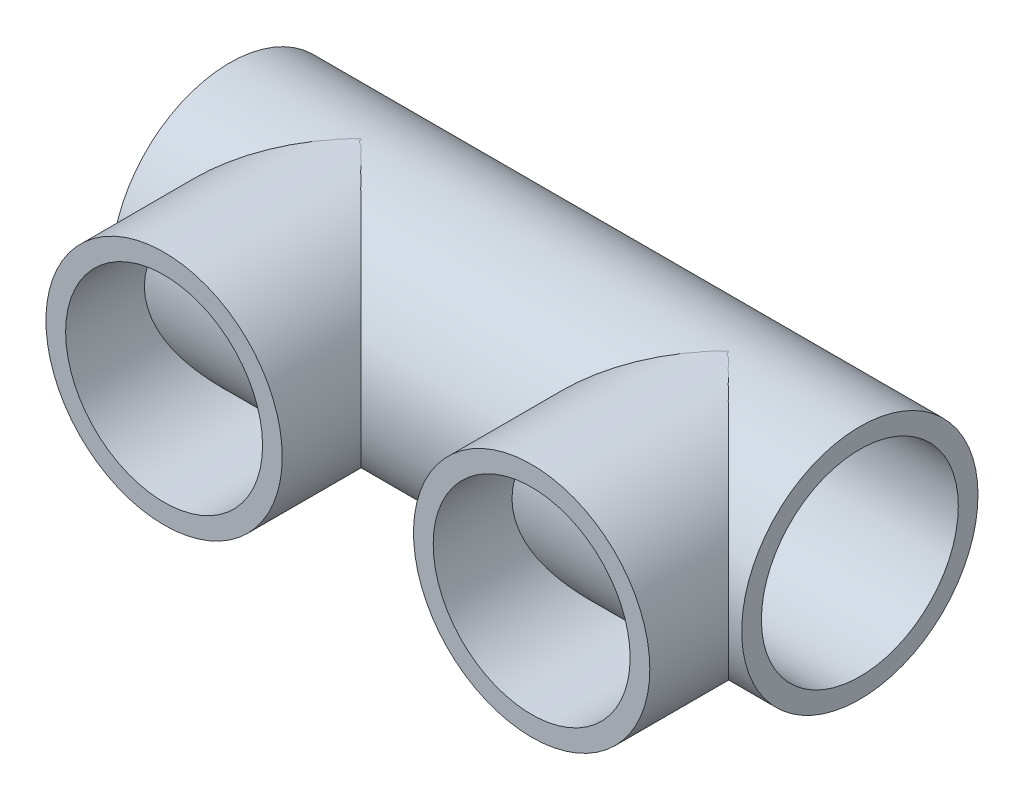
ISO-10303-21;
HEADER;
FILE_DESCRIPTION(('STEP AP214'),'2;1');
FILE_NAME('part.step','',(''),(''),'','','');
FILE_SCHEMA(('AUTOMOTIVE_DESIGN { 1 0 10303 214 1 1 1 1 }'));
ENDSEC;
DATA;
#1=APPLICATION_CONTEXT('core data for automotive mechanical design processes');
#2=APPLICATION_PROTOCOL_DEFINITION('international standard','automotive_design',2000,#1);
#3=PRODUCT_CONTEXT('',#1,'mechanical');
#4=PRODUCT('Part','Part','',(#3));
#5=PRODUCT_RELATED_PRODUCT_CATEGORY('part','',(#4));
#6=PRODUCT_DEFINITION_FORMATION('','',#4);
#7=PRODUCT_DEFINITION_CONTEXT('part definition',#1,'design');
#8=PRODUCT_DEFINITION('design','',#6,#7);
#9=PRODUCT_DEFINITION_SHAPE('','',#8);
#10=(LENGTH_UNIT() NAMED_UNIT(*) SI_UNIT(.MILLI.,.METRE.));
#11=(NAMED_UNIT(*) PLANE_ANGLE_UNIT() SI_UNIT($,.RADIAN.));
#12=(NAMED_UNIT(*) SI_UNIT($,.STERADIAN.) SOLID_ANGLE_UNIT());
#13=UNCERTAINTY_MEASURE_WITH_UNIT(LENGTH_MEASURE(1.E-05),#10,'distance_accuracy_value','');
#14=(GEOMETRIC_REPRESENTATION_CONTEXT(3) GLOBAL_UNCERTAINTY_ASSIGNED_CONTEXT((#13)) GLOBAL_UNIT_ASSIGNED_CONTEXT((#10,
#11,#12)) REPRESENTATION_CONTEXT('',''));
#15=CARTESIAN_POINT('',(0.,0.,0.));
#16=DIRECTION('',(0.,0.,1.));
#17=DIRECTION('',(1.,0.,0.));
#18=AXIS2_PLACEMENT_3D('',#15,#16,#17);
#19=CARTESIAN_POINT('',(38.,0.,15.));
#20=DIRECTION('',(0.,0.,-1.));
#21=DIRECTION('',(-1.,0.,0.));
#22=AXIS2_PLACEMENT_3D('',#19,#20,#21);
#23=CYLINDRICAL_SURFACE('',#22,7.5);
#24=CARTESIAN_POINT('',(38.,0.,15.));
#25=DIRECTION('',(0.,0.,1.));
#26=DIRECTION('',(1.,0.,0.));
#27=AXIS2_PLACEMENT_3D('',#24,#25,#26);
#28=CIRCLE('',#27,7.5);
#29=CARTESIAN_POINT('',(45.5,0.,15.));
#30=VERTEX_POINT('',#29);
#31=EDGE_CURVE('E94',#30,#30,#28,.T.);
#32=ORIENTED_EDGE('',*,*,#31,.T.);
#33=EDGE_LOOP('',(#32));
#34=FACE_BOUND('',#33,.T.);
#35=CARTESIAN_POINT('',(30.5,0.,9.));
#36=CARTESIAN_POINT('',(30.5000010057864,0.178153969147354,8.99999902078454));
#37=CARTESIAN_POINT('',(30.5063589008688,0.35632298261134,8.99469882283173));
#38=CARTESIAN_POINT('',(30.5316723160512,0.711146050434394,8.97362079437447));
#39=CARTESIAN_POINT('',(30.55062928056,0.887799928739864,8.95784176253385));
#40=CARTESIAN_POINT('',(30.60080410535,1.2382455909623,8.91615976232059));
#41=CARTESIAN_POINT('',(30.6320292203917,1.41203561786725,8.89025080366843));
#42=CARTESIAN_POINT('',(30.7061969223034,1.7553587935121,8.82888045728097));
#43=CARTESIAN_POINT('',(30.7491394354058,1.92489196904391,8.7934191296832));
#44=CARTESIAN_POINT('',(30.845757960041,2.25757382136561,8.71392164535409));
#45=CARTESIAN_POINT('',(30.8993647687716,2.42075594549693,8.66994081938386));
#46=CARTESIAN_POINT('',(31.0167634667215,2.74108056207663,8.5740565095168));
#47=CARTESIAN_POINT('',(31.0805597989083,2.89822038262574,8.52214957000969));
#48=CARTESIAN_POINT('',(31.2175507718221,3.20573129384688,8.41130175961026));
#49=CARTESIAN_POINT('',(31.2907441109994,3.35610331801683,8.35236186291027));
#50=CARTESIAN_POINT('',(31.4458071898899,3.64967491217059,8.22832182005492));
#51=CARTESIAN_POINT('',(31.5276787720561,3.79287294952446,8.16322036607252));
#52=CARTESIAN_POINT('',(31.7309689457276,4.12303253202533,8.00284518096207));
#53=CARTESIAN_POINT('',(31.8558670347129,4.30674703745717,7.90527271928849));
#54=CARTESIAN_POINT('',(32.1190978886581,4.65977577954254,7.70246473974503));
#55=CARTESIAN_POINT('',(32.2574352007178,4.8290851056693,7.59722663127292));
#56=CARTESIAN_POINT('',(32.5466979666458,5.15352808798878,7.3810053748656));
#57=CARTESIAN_POINT('',(32.6976542347339,5.30862498346819,7.27000843062842));
#58=CARTESIAN_POINT('',(33.010990015136,5.60411971357477,7.04473932058204));
#59=CARTESIAN_POINT('',(33.1733680876061,5.74451939541484,6.93046756867072));
#60=CARTESIAN_POINT('',(33.5121973741132,6.01308771712544,6.69886421944047));
#61=CARTESIAN_POINT('',(33.6888525475146,6.14098379728719,6.58151500715291));
#62=CARTESIAN_POINT('',(34.0535309946945,6.38146685964443,6.34861374542259));
#63=CARTESIAN_POINT('',(34.2415580448988,6.49404871544582,6.23306230918773));
#64=CARTESIAN_POINT('',(34.6288007157147,6.70323191819961,6.00751709342867));
#65=CARTESIAN_POINT('',(34.8279884489955,6.79987090825118,5.89751066108234));
#66=CARTESIAN_POINT('',(35.2383297636461,6.97660978913542,5.68733200599137));
#67=CARTESIAN_POINT('',(35.4494729521105,7.05672377219729,5.58715144248699));
#68=CARTESIAN_POINT('',(35.9050423822036,7.20581139804351,5.39375054153033));
#69=CARTESIAN_POINT('',(36.1507335570095,7.27303815984157,5.30206159225364));
#70=CARTESIAN_POINT('',(36.5296101494213,7.35558556376292,5.1862924366239));
#71=CARTESIAN_POINT('',(36.6575371684877,7.38004237965331,5.15134611493354));
#72=CARTESIAN_POINT('',(36.9164552559326,7.42247386801848,5.0900167217734));
#73=CARTESIAN_POINT('',(37.0474446705555,7.44045195679875,5.0636291379211));
#74=CARTESIAN_POINT('',(37.3134847629683,7.4697274665406,5.0203457675602));
#75=CARTESIAN_POINT('',(37.448565957836,7.48093648768762,5.00357571644289));
#76=CARTESIAN_POINT('',(37.7200521910013,7.49600593121143,4.98097213613006));
#77=CARTESIAN_POINT('',(37.8564571043124,7.49986704072694,4.97513758430392));
#78=CARTESIAN_POINT('',(38.1292913300053,7.50012618903397,4.97474699327439));
#79=CARTESIAN_POINT('',(38.265720642439,7.49652421174242,4.98019097837639));
#80=CARTESIAN_POINT('',(38.5373004697741,7.48196560183749,5.00203537341002));
#81=CARTESIAN_POINT('',(38.6724508268724,7.4710080733606,5.01843711793209));
#82=CARTESIAN_POINT('',(38.9514339457437,7.44083697124258,5.06307474091476));
#83=CARTESIAN_POINT('',(39.0950608694159,7.42101578104718,5.09217681926413));
#84=CARTESIAN_POINT('',(39.378613681429,7.37360940002843,5.16058211520389));
#85=CARTESIAN_POINT('',(39.5185368742111,7.34601871582733,5.19989254901968));
#86=CARTESIAN_POINT('',(39.7944307993402,7.28354878875738,5.28704001546879));
#87=CARTESIAN_POINT('',(39.9303898208141,7.24865003881939,5.33489981723021));
#88=CARTESIAN_POINT('',(40.1977246528952,7.17212216286467,5.43734828215007));
#89=CARTESIAN_POINT('',(40.3291013884723,7.13049440482164,5.49193557710803));
#90=CARTESIAN_POINT('',(40.6634059310218,7.01451779745416,5.64001965117919));
#91=CARTESIAN_POINT('',(40.8629031623279,6.93533714297783,5.73749761155111));
#92=CARTESIAN_POINT('',(41.250986005591,6.76212098875534,5.94067179855828));
#93=CARTESIAN_POINT('',(41.4395651296926,6.6680767779642,6.04637282590248));
#94=CARTESIAN_POINT('',(41.8064859629529,6.46564864959083,6.26237432607995));
#95=CARTESIAN_POINT('',(41.9848134666537,6.35724549072149,6.372680832086));
#96=CARTESIAN_POINT('',(42.3311557538796,6.12653021732014,6.59479170795521));
#97=CARTESIAN_POINT('',(42.499172598227,6.00422089628763,6.70659577301854));
#98=CARTESIAN_POINT('',(42.833390753746,5.73900605569622,6.93513068751245));
#99=CARTESIAN_POINT('',(42.9990369092601,5.59535765371466,7.05181317180441));
#100=CARTESIAN_POINT('',(43.3184002203485,5.29273175973209,7.28169682859756));
#101=CARTESIAN_POINT('',(43.472115599873,5.13375199332901,7.39489748127484));
#102=CARTESIAN_POINT('',(43.7664034337602,4.80081846303794,7.61524275681291));
#103=CARTESIAN_POINT('',(43.9070000688744,4.62689343117928,7.72239837178886));
#104=CARTESIAN_POINT('',(44.1740521920132,4.26401070130268,7.92853846042055));
#105=CARTESIAN_POINT('',(44.3005124564013,4.0750581179137,8.02752569101303));
#106=CARTESIAN_POINT('',(44.5086693739933,3.73058078632899,8.19205561121926));
#107=CARTESIAN_POINT('',(44.5937524796657,3.57817312113296,8.25985939036692));
#108=CARTESIAN_POINT('',(44.7540940717062,3.26543648544591,8.38841402039979));
#109=CARTESIAN_POINT('',(44.8293548763508,3.10510939647011,8.44916653516056));
#110=CARTESIAN_POINT('',(44.9691660359821,2.77713682738387,8.5625699831515));
#111=CARTESIAN_POINT('',(45.0337199839725,2.6094938262962,8.61522363376343));
#112=CARTESIAN_POINT('',(45.1512556136575,2.26764337646391,8.71144750368668));
#113=CARTESIAN_POINT('',(45.2042371077518,2.09343582135535,8.75501757574411));
#114=CARTESIAN_POINT('',(45.2981383828374,1.73815745690473,8.83244656264963));
#115=CARTESIAN_POINT('',(45.3389613536125,1.5570438723224,8.86622747837933));
#116=CARTESIAN_POINT('',(45.407237578285,1.19061277670687,8.92282485554544));
#117=CARTESIAN_POINT('',(45.4346908023521,1.00529525629487,8.94564129251806));
#118=CARTESIAN_POINT('',(45.475665348686,0.632166039498279,8.97972399159536));
#119=CARTESIAN_POINT('',(45.4891940195714,0.444355711746269,8.99099634602051));
#120=CARTESIAN_POINT('',(45.502055814718,0.0679219552883391,9.00171249935012));
#121=CARTESIAN_POINT('',(45.5013904835677,-0.120701382712558,9.00115758529573));
#122=CARTESIAN_POINT('',(45.4868199274725,-0.474324637421768,8.98901891067002));
#123=CARTESIAN_POINT('',(45.4745149081936,-0.639440216493619,8.97876813322393));
#124=CARTESIAN_POINT('',(45.4391329303291,-0.967764857264276,8.94933527598237));
#125=CARTESIAN_POINT('',(45.4160523964841,-1.13097326773745,8.93015023184924));
#126=CARTESIAN_POINT('',(45.3594868704201,-1.45426161073626,8.88323127277689));
#127=CARTESIAN_POINT('',(45.3260052823641,-1.61434254865923,8.85550015490737));
#128=CARTESIAN_POINT('',(45.2491080588724,-1.9305229069349,8.79199057069989));
#129=CARTESIAN_POINT('',(45.205688639473,-2.0866207854552,8.75620903914643));
#130=CARTESIAN_POINT('',(45.108867300918,-2.39595575206166,8.67670556523535));
#131=CARTESIAN_POINT('',(45.055343737124,-2.54912988520823,8.63288707011419));
#132=CARTESIAN_POINT('',(44.9393284207758,-2.84986550446535,8.53833445929783));
#133=CARTESIAN_POINT('',(44.8768332101543,-2.99742479849771,8.48759767737068));
#134=CARTESIAN_POINT('',(44.6768545198958,-3.43085007661301,8.32611263438776));
#135=CARTESIAN_POINT('',(44.5268249353359,-3.7076298707447,8.20604568840655));
#136=CARTESIAN_POINT('',(44.2436294139193,-4.16146504282976,7.9829540827251));
#137=CARTESIAN_POINT('',(44.1171593735551,-4.34502322432915,7.88431346355617));
#138=CARTESIAN_POINT('',(43.8507061511021,-4.69766413926584,7.67942018895149));
#139=CARTESIAN_POINT('',(43.7107177718954,-4.86674125795192,7.57316461002928));
#140=CARTESIAN_POINT('',(43.4180688180848,-5.19059982119121,7.35499304047176));
#141=CARTESIAN_POINT('',(43.2653734563386,-5.34533939582272,7.24306186228091));
#142=CARTESIAN_POINT('',(42.9484911054935,-5.63996764192879,7.01607658620792));
#143=CARTESIAN_POINT('',(42.7843057415246,-5.77985840658274,6.90102293136816));
#144=CARTESIAN_POINT('',(42.4418199255305,-6.04717082256289,6.66811076076273));
#145=CARTESIAN_POINT('',(42.2633194406217,-6.17432449798081,6.55023889904902));
#146=CARTESIAN_POINT('',(41.8948232872876,-6.41315766694555,6.31659026601953));
#147=CARTESIAN_POINT('',(41.7048235175923,-6.52483159229073,6.20081426155412));
#148=CARTESIAN_POINT('',(41.3135359844517,-6.73196403522599,5.97528404480667));
#149=CARTESIAN_POINT('',(41.1122799166768,-6.82746530850324,5.86551449092197));
#150=CARTESIAN_POINT('',(40.6976390885698,-7.00166485614641,5.65642800691347));
#151=CARTESIAN_POINT('',(40.4842656716632,-7.0803785279743,5.55710154124142));
#152=CARTESIAN_POINT('',(40.0271470542365,-7.22512616429833,5.3677608452465));
#153=CARTESIAN_POINT('',(39.7823336292931,-7.2896711036192,5.27909827205668));
#154=CARTESIAN_POINT('',(39.4051389236664,-7.36831476782095,5.16817268337303));
#155=CARTESIAN_POINT('',(39.2778370522846,-7.39149053509204,5.13489104828035));
#156=CARTESIAN_POINT('',(39.0203240551805,-7.43141253901732,5.07694250264753));
#157=CARTESIAN_POINT('',(38.8901144842097,-7.44816212858883,5.05227110024809));
#158=CARTESIAN_POINT('',(38.625923754923,-7.47502890065712,5.01243802508993));
#159=CARTESIAN_POINT('',(38.4919160314498,-7.48506345867346,4.99739491738158));
#160=CARTESIAN_POINT('',(38.2227775965427,-7.49790063456364,4.97811444408972));
#161=CARTESIAN_POINT('',(38.087646980347,-7.50070385960703,4.97387617129254));
#162=CARTESIAN_POINT('',(37.8175089270921,-7.49899629069525,4.97645022541163));
#163=CARTESIAN_POINT('',(37.6825015236201,-7.49448388963127,4.98326498047544));
#164=CARTESIAN_POINT('',(37.4138881918096,-7.47827432173868,5.00755638570879));
#165=CARTESIAN_POINT('',(37.2802824510004,-7.46657620568914,5.02503444448083));
#166=CARTESIAN_POINT('',(37.0014966083041,-7.4346960924861,5.07209839016363));
#167=CARTESIAN_POINT('',(36.8565893293646,-7.413746778113,5.10277057583901));
#168=CARTESIAN_POINT('',(36.5706478439368,-7.36396926574169,5.17434519371698));
#169=CARTESIAN_POINT('',(36.4296165406177,-7.33513533000248,5.21525507417604));
#170=CARTESIAN_POINT('',(36.1516494498847,-7.27007805248166,5.30556913487443));
#171=CARTESIAN_POINT('',(36.0147256638288,-7.23383509565046,5.35499580720953));
#172=CARTESIAN_POINT('',(35.7455774140882,-7.15452721595988,5.46050371883802));
#173=CARTESIAN_POINT('',(35.6133519617119,-7.11146373890784,5.51658354717095));
#174=CARTESIAN_POINT('',(35.2767063934344,-6.99155586387444,5.6685294244834));
#175=CARTESIAN_POINT('',(35.0758022906916,-6.90978803738,5.76832175679893));
#176=CARTESIAN_POINT('',(34.6851272521608,-6.73110635619061,5.97586830418356));
#177=CARTESIAN_POINT('',(34.4953628780198,-6.63418369554437,6.08362712899318));
#178=CARTESIAN_POINT('',(34.1262956917846,-6.42568145623929,6.30345978749845));
#179=CARTESIAN_POINT('',(33.9470072822267,-6.31408235452025,6.41553922570414));
#180=CARTESIAN_POINT('',(33.5989986834814,-6.07663937077913,6.64087740103313));
#181=CARTESIAN_POINT('',(33.4302763738128,-5.95079836124849,6.7541358961795));
#182=CARTESIAN_POINT('',(33.0954463913781,-5.67839669428734,6.98492870322204));
#183=CARTESIAN_POINT('',(32.929874791307,-5.53112167311798,7.10239957862695));
#184=CARTESIAN_POINT('',(32.6110046018145,-5.22093841455887,7.33343097863304));
#185=CARTESIAN_POINT('',(32.4577079474142,-5.05802772122801,7.4469908851078));
#186=CARTESIAN_POINT('',(32.1646960278275,-4.71695610953152,7.66756141505401));
#187=CARTESIAN_POINT('',(32.0249554746028,-4.53882479962971,7.77458408953089));
#188=CARTESIAN_POINT('',(31.7601552963877,-4.16729265611715,7.97989206399108));
#189=CARTESIAN_POINT('',(31.6350900664182,-3.973897699699,8.07818069628259));
#190=CARTESIAN_POINT('',(31.4316424843745,-3.62440515617799,8.23957223167813));
#191=CARTESIAN_POINT('',(31.3495573333788,-3.47161569354203,8.30519618516591));
#192=CARTESIAN_POINT('',(31.1952124128116,-3.15837516797195,8.42929577556614));
#193=CARTESIAN_POINT('',(31.1229503824741,-2.99792587945219,8.48777305695304));
#194=CARTESIAN_POINT('',(30.9891645021752,-2.6701114442103,8.59652830380039));
#195=CARTESIAN_POINT('',(30.9276301940973,-2.50275323192241,8.64681425155713));
#196=CARTESIAN_POINT('',(30.8160810401182,-2.16181862745619,8.73828768584255));
#197=CARTESIAN_POINT('',(30.7660645945027,-1.98824310267388,8.77947643584721));
#198=CARTESIAN_POINT('',(30.6858246322948,-1.66599071263965,8.84571883836567));
#199=CARTESIAN_POINT('',(30.6536809293438,-1.51810805595959,8.87232576259307));
#200=CARTESIAN_POINT('',(30.5982664517213,-1.21958147191258,8.91826321166774));
#201=CARTESIAN_POINT('',(30.5749945861202,-1.06893788643362,8.937594631147));
#202=CARTESIAN_POINT('',(30.5376259074186,-0.765709608762064,8.96866317358953));
#203=CARTESIAN_POINT('',(30.5235306591848,-0.613124590022175,8.98039900129264));
#204=CARTESIAN_POINT('',(30.5047187513097,-0.307029900041264,8.99606660555182));
#205=CARTESIAN_POINT('',(30.4999991332842,-0.153520535808256,9.00000084381888));
#206=CARTESIAN_POINT('',(30.5,0.,9.));
#207=B_SPLINE_CURVE_WITH_KNOTS('',3,(#35,#36,#37,#38,#39,#40,#41,#42,#43,#44,#45,#46,#47,#48,
#49,#50,#51,#52,#53,#54,#55,#56,#57,#58,#59,#60,#61,#62,#63,#64,#65,#66,#67,#68,#69,#70,#71,#72,
#73,#74,#75,#76,#77,#78,#79,#80,#81,#82,#83,#84,#85,#86,#87,#88,#89,#90,#91,#92,#93,#94,#95,#96,
#97,#98,#99,#100,#101,#102,#103,#104,#105,#106,#107,#108,#109,#110,#111,#112,#113,#114,#115,
#116,#117,#118,#119,#120,#121,#122,#123,#124,#125,#126,#127,#128,#129,#130,#131,#132,#133,#134,
#135,#136,#137,#138,#139,#140,#141,#142,#143,#144,#145,#146,#147,#148,#149,#150,#151,#152,#153,
#154,#155,#156,#157,#158,#159,#160,#161,#162,#163,#164,#165,#166,#167,#168,#169,#170,#171,#172,
#173,#174,#175,#176,#177,#178,#179,#180,#181,#182,#183,#184,#185,#186,#187,#188,#189,#190,#191,
#192,#193,#194,#195,#196,#197,#198,#199,#200,#201,#202,#203,#204,#205,#206),.UNSPECIFIED.,.T.,
.F.,(4,2,2,2,2,2,2,2,2,2,2,2,2,2,2,2,2,2,2,2,2,2,2,2,2,2,2,2,2,2,2,2,2,2,2,2,2,2,2,2,2,2,2,2,2,
2,2,2,2,2,2,2,2,2,2,2,2,2,2,2,2,2,2,2,2,2,2,2,2,2,2,2,2,2,2,2,2,2,2,2,2,2,2,2,2,4),(0.,
0.534297796692273,1.0686568580353,1.60333238891945,2.13800455380018,2.66931409957204,
3.20085594943621,3.73232425638237,4.26390562469868,4.99075959099004,5.71786034724948,
6.44679159972022,7.17563112650743,7.91788024572627,8.66037722252597,9.40109517119902,
10.141178813278,10.950598534304,11.3547713038965,11.7587306357153,12.1678573509564,
12.5769458049007,12.9860351404372,13.3951743097263,13.838135531958,14.2814107372559,
14.7258845921746,15.1702682011593,15.8763767093074,16.5829005896972,17.2903809898999,
17.9977195202,18.7420747756893,19.4865406263657,20.2296059721248,20.9724194889895,
21.5336836960618,22.0948151920935,22.6557580011227,23.2167099028886,23.7820157015388,
24.3473227614856,24.9123313300357,25.4772784147726,25.9743543719838,26.4715953737385,
26.9686738045472,27.4659418204952,27.9696299704896,28.4735127879239,29.4807431504287,
30.2111783664193,30.941895524348,31.6746834402778,32.4073679203559,33.1531656239326,
33.8992309051474,34.6432919308857,35.3866675462833,36.1886536472029,36.5890893055117,
36.9893157477726,37.3943803830756,37.7994110065414,38.2045306198596,38.6097037603122,
39.0577892129779,39.5062016150053,39.9558169112731,40.4053370257681,41.1205193642305,
41.8361188254814,42.5526800144953,43.2690969349207,44.020724889197,44.7724710977106,
45.5227868601687,46.2728151136122,46.8286455109914,47.3843477680595,47.9395052218939,
48.494585523421,48.9551292056469,49.4156162386303,49.8761817768155,50.3366019651612),.UNSPECIFIED.);
#208=CARTESIAN_POINT('',(30.5,0.,9.));
#209=VERTEX_POINT('',#208);
#210=EDGE_CURVE('E58',#209,#209,#207,.T.);
#211=ORIENTED_EDGE('',*,*,#210,.T.);
#212=EDGE_LOOP('',(#211));
#213=FACE_BOUND('',#212,.T.);
#214=ADVANCED_FACE('F53',(#34,#213),#23,.F.);
#215=CARTESIAN_POINT('',(38.,0.,15.));
#216=DIRECTION('',(0.,0.,-1.));
#217=DIRECTION('',(-1.,0.,0.));
#218=AXIS2_PLACEMENT_3D('',#215,#216,#217);
#219=CYLINDRICAL_SURFACE('',#218,9.);
#220=CARTESIAN_POINT('',(38.,0.,15.));
#221=DIRECTION('',(0.,0.,1.));
#222=DIRECTION('',(1.,0.,0.));
#223=AXIS2_PLACEMENT_3D('',#220,#221,#222);
#224=CIRCLE('',#223,9.);
#225=CARTESIAN_POINT('',(47.,0.,15.));
#226=VERTEX_POINT('',#225);
#227=EDGE_CURVE('E75',#226,#226,#224,.T.);
#228=ORIENTED_EDGE('',*,*,#227,.F.);
#229=EDGE_LOOP('',(#228));
#230=FACE_BOUND('',#229,.T.);
#231=CARTESIAN_POINT('',(38.,0.,0.));
#232=DIRECTION('',(-0.707106781186548,0.,-0.707106781186548));
#233=DIRECTION('',(0.707106781186548,0.,-0.707106781186548));
#234=AXIS2_PLACEMENT_3D('',#231,#232,#233);
#235=ELLIPSE('',#234,12.7279220613579,9.);
#236=CARTESIAN_POINT('',(38.,-9.,0.));
#237=VERTEX_POINT('',#236);
#238=CARTESIAN_POINT('',(38.,9.,0.));
#239=VERTEX_POINT('',#238);
#240=EDGE_CURVE('E68',#237,#239,#235,.T.);
#241=ORIENTED_EDGE('',*,*,#240,.F.);
#242=CARTESIAN_POINT('',(38.,0.,0.));
#243=DIRECTION('',(0.707106781186548,0.,-0.707106781186548));
#244=DIRECTION('',(-0.707106781186548,0.,-0.707106781186548));
#245=AXIS2_PLACEMENT_3D('',#242,#243,#244);
#246=ELLIPSE('',#245,12.7279220613579,9.);
#247=EDGE_CURVE('E13',#239,#237,#246,.T.);
#248=ORIENTED_EDGE('',*,*,#247,.F.);
#249=EDGE_LOOP('',(#241,#248));
#250=FACE_BOUND('',#249,.T.);
#251=ADVANCED_FACE('F77',(#230,#250),#219,.T.);
#252=CARTESIAN_POINT('',(38.,0.,15.));
#253=DIRECTION('',(0.,0.,1.));
#254=DIRECTION('',(1.,0.,0.));
#255=AXIS2_PLACEMENT_3D('',#252,#253,#254);
#256=PLANE('',#255);
#257=ORIENTED_EDGE('',*,*,#31,.F.);
#258=EDGE_LOOP('',(#257));
#259=FACE_BOUND('',#258,.T.);
#260=ORIENTED_EDGE('',*,*,#227,.T.);
#261=EDGE_LOOP('',(#260));
#262=FACE_BOUND('',#261,.T.);
#263=ADVANCED_FACE('F79',(#259,#262),#256,.T.);
#264=CARTESIAN_POINT('',(48.,0.,0.));
#265=DIRECTION('',(-1.,0.,0.));
#266=DIRECTION('',(0.,0.,1.));
#267=AXIS2_PLACEMENT_3D('',#264,#265,#266);
#268=CYLINDRICAL_SURFACE('',#267,9.);
#269=ORIENTED_EDGE('',*,*,#210,.F.);
#270=EDGE_LOOP('',(#269));
#271=FACE_BOUND('',#270,.T.);
#272=ORIENTED_EDGE('',*,*,#240,.T.);
#273=ORIENTED_EDGE('',*,*,#247,.T.);
#274=EDGE_LOOP('',(#272,#273));
#275=FACE_BOUND('',#274,.T.);
#276=ADVANCED_FACE('F55',(#271,#275),#268,.F.);
#277=CLOSED_SHELL('',(#214,#251,#263,#276));
#278=MANIFOLD_SOLID_BREP('B2',#277);
#279=CARTESIAN_POINT('',(10.,0.,15.));
#280=DIRECTION('',(0.,0.,-1.));
#281=DIRECTION('',(-1.,0.,0.));
#282=AXIS2_PLACEMENT_3D('',#279,#280,#281);
#283=CYLINDRICAL_SURFACE('',#282,7.5);
#284=CARTESIAN_POINT('',(10.,0.,15.));
#285=DIRECTION('',(0.,0.,1.));
#286=DIRECTION('',(1.,0.,0.));
#287=AXIS2_PLACEMENT_3D('',#284,#285,#286);
#288=CIRCLE('',#287,7.5);
#289=CARTESIAN_POINT('',(17.5,0.,15.));
#290=VERTEX_POINT('',#289);
#291=EDGE_CURVE('E196',#290,#290,#288,.T.);
#292=ORIENTED_EDGE('',*,*,#291,.T.);
#293=EDGE_LOOP('',(#292));
#294=FACE_BOUND('',#293,.T.);
#295=CARTESIAN_POINT('',(2.5,0.,9.));
#296=CARTESIAN_POINT('',(2.50000100578641,0.178153969147354,8.99999902078454));
#297=CARTESIAN_POINT('',(2.50635890086878,0.35632298261134,8.99469882283172));
#298=CARTESIAN_POINT('',(2.53167231605117,0.711146050434394,8.97362079437447));
#299=CARTESIAN_POINT('',(2.55062928055998,0.887799928739863,8.95784176253386));
#300=CARTESIAN_POINT('',(2.60080410535,1.2382455909623,8.9161597623206));
#301=CARTESIAN_POINT('',(2.63202922039173,1.41203561786725,8.89025080366843));
#302=CARTESIAN_POINT('',(2.70619692230343,1.7553587935121,8.82888045728097));
#303=CARTESIAN_POINT('',(2.74913943540584,1.92489196904391,8.7934191296832));
#304=CARTESIAN_POINT('',(2.84575796004095,2.25757382136561,8.71392164535409));
#305=CARTESIAN_POINT('',(2.89936476877157,2.42075594549693,8.66994081938386));
#306=CARTESIAN_POINT('',(3.01676346672153,2.74108056207663,8.5740565095168));
#307=CARTESIAN_POINT('',(3.08055979890835,2.89822038262574,8.5221495700097));
#308=CARTESIAN_POINT('',(3.21755077182215,3.20573129384688,8.41130175961026));
#309=CARTESIAN_POINT('',(3.29074411099936,3.35610331801683,8.35236186291027));
#310=CARTESIAN_POINT('',(3.44580718988993,3.64967491217059,8.22832182005492));
#311=CARTESIAN_POINT('',(3.52767877205613,3.79287294952446,8.16322036607252));
#312=CARTESIAN_POINT('',(3.73096894572758,4.12303253202533,8.00284518096207));
#313=CARTESIAN_POINT('',(3.85586703471295,4.30674703745717,7.9052727192885));
#314=CARTESIAN_POINT('',(4.11909788865808,4.65977577954254,7.70246473974503));
#315=CARTESIAN_POINT('',(4.25743520071783,4.8290851056693,7.59722663127292));
#316=CARTESIAN_POINT('',(4.54669796664575,5.15352808798878,7.3810053748656));
#317=CARTESIAN_POINT('',(4.69765423473387,5.30862498346819,7.27000843062842));
#318=CARTESIAN_POINT('',(5.01099001513604,5.60411971357477,7.04473932058204));
#319=CARTESIAN_POINT('',(5.17336808760611,5.74451939541484,6.93046756867072));
#320=CARTESIAN_POINT('',(5.51219737411319,6.01308771712544,6.69886421944047));
#321=CARTESIAN_POINT('',(5.68885254751465,6.1409837972872,6.58151500715291));
#322=CARTESIAN_POINT('',(6.05353099469456,6.38146685964444,6.34861374542259));
#323=CARTESIAN_POINT('',(6.24155804489881,6.49404871544582,6.23306230918772));
#324=CARTESIAN_POINT('',(6.62880071571472,6.70323191819961,6.00751709342867));
#325=CARTESIAN_POINT('',(6.82798844899555,6.79987090825118,5.89751066108233));
#326=CARTESIAN_POINT('',(7.23832976364614,6.97660978913542,5.68733200599137));
#327=CARTESIAN_POINT('',(7.44947295211048,7.05672377219729,5.58715144248699));
#328=CARTESIAN_POINT('',(7.90504238220356,7.20581139804351,5.39375054153033));
#329=CARTESIAN_POINT('',(8.15073355700954,7.27303815984157,5.30206159225364));
#330=CARTESIAN_POINT('',(8.5296101494213,7.35558556376292,5.1862924366239));
#331=CARTESIAN_POINT('',(8.65753716848773,7.38004237965331,5.15134611493354));
#332=CARTESIAN_POINT('',(8.9164552559326,7.42247386801848,5.0900167217734));
#333=CARTESIAN_POINT('',(9.04744467055553,7.44045195679875,5.0636291379211));
#334=CARTESIAN_POINT('',(9.31348476296828,7.4697274665406,5.0203457675602));
#335=CARTESIAN_POINT('',(9.44856595783599,7.48093648768762,5.00357571644289));
#336=CARTESIAN_POINT('',(9.72005219100128,7.49600593121143,4.98097213613006));
#337=CARTESIAN_POINT('',(9.85645710431239,7.49986704072694,4.97513758430392));
#338=CARTESIAN_POINT('',(10.1292913300053,7.50012618903397,4.97474699327439));
#339=CARTESIAN_POINT('',(10.265720642439,7.49652421174242,4.98019097837639));
#340=CARTESIAN_POINT('',(10.537300469774,7.48196560183749,5.00203537341002));
#341=CARTESIAN_POINT('',(10.6724508268724,7.4710080733606,5.01843711793209));
#342=CARTESIAN_POINT('',(10.9514339457437,7.44083697124258,5.06307474091476));
#343=CARTESIAN_POINT('',(11.0950608694159,7.42101578104718,5.09217681926414));
#344=CARTESIAN_POINT('',(11.378613681429,7.37360940002843,5.1605821152039));
#345=CARTESIAN_POINT('',(11.5185368742111,7.34601871582733,5.19989254901968));
#346=CARTESIAN_POINT('',(11.7944307993402,7.28354878875739,5.28704001546879));
#347=CARTESIAN_POINT('',(11.9303898208141,7.24865003881939,5.3348998172302));
#348=CARTESIAN_POINT('',(12.1977246528952,7.17212216286467,5.43734828215006));
#349=CARTESIAN_POINT('',(12.3291013884723,7.13049440482164,5.49193557710803));
#350=CARTESIAN_POINT('',(12.6634059310218,7.01451779745416,5.64001965117919));
#351=CARTESIAN_POINT('',(12.8629031623279,6.93533714297783,5.73749761155111));
#352=CARTESIAN_POINT('',(13.250986005591,6.76212098875535,5.94067179855828));
#353=CARTESIAN_POINT('',(13.4395651296926,6.66807677796421,6.04637282590247));
#354=CARTESIAN_POINT('',(13.8064859629529,6.46564864959084,6.26237432607994));
#355=CARTESIAN_POINT('',(13.9848134666537,6.35724549072149,6.37268083208599));
#356=CARTESIAN_POINT('',(14.3311557538796,6.12653021732015,6.5947917079552));
#357=CARTESIAN_POINT('',(14.499172598227,6.00422089628764,6.70659577301853));
#358=CARTESIAN_POINT('',(14.833390753746,5.73900605569623,6.93513068751244));
#359=CARTESIAN_POINT('',(14.9990369092601,5.59535765371467,7.0518131718044));
#360=CARTESIAN_POINT('',(15.3184002203484,5.29273175973211,7.28169682859756));
#361=CARTESIAN_POINT('',(15.4721155998729,5.13375199332902,7.39489748127484));
#362=CARTESIAN_POINT('',(15.7664034337602,4.80081846303795,7.61524275681291));
#363=CARTESIAN_POINT('',(15.9070000688744,4.62689343117929,7.72239837178886));
#364=CARTESIAN_POINT('',(16.1740521920132,4.2640107013027,7.92853846042054));
#365=CARTESIAN_POINT('',(16.3005124564012,4.07505811791372,8.02752569101302));
#366=CARTESIAN_POINT('',(16.5086693739933,3.730580786329,8.19205561121925));
#367=CARTESIAN_POINT('',(16.5937524796657,3.57817312113298,8.25985939036692));
#368=CARTESIAN_POINT('',(16.7540940717062,3.26543648544592,8.38841402039979));
#369=CARTESIAN_POINT('',(16.8293548763508,3.10510939647013,8.44916653516056));
#370=CARTESIAN_POINT('',(16.9691660359821,2.77713682738389,8.5625699831515));
#371=CARTESIAN_POINT('',(17.0337199839725,2.60949382629622,8.61522363376343));
#372=CARTESIAN_POINT('',(17.1512556136575,2.26764337646393,8.71144750368668));
#373=CARTESIAN_POINT('',(17.2042371077518,2.09343582135537,8.7550175757441));
#374=CARTESIAN_POINT('',(17.2981383828374,1.73815745690475,8.83244656264963));
#375=CARTESIAN_POINT('',(17.3389613536125,1.55704387232242,8.86622747837933));
#376=CARTESIAN_POINT('',(17.407237578285,1.19061277670688,8.92282485554544));
#377=CARTESIAN_POINT('',(17.4346908023521,1.00529525629488,8.94564129251806));
#378=CARTESIAN_POINT('',(17.475665348686,0.632166039498299,8.97972399159536));
#379=CARTESIAN_POINT('',(17.4891940195714,0.44435571174629,8.99099634602051));
#380=CARTESIAN_POINT('',(17.502055814718,0.0679219552883593,9.00171249935012));
#381=CARTESIAN_POINT('',(17.5013904835677,-0.120701382712539,9.00115758529573));
#382=CARTESIAN_POINT('',(17.4868199274725,-0.47432463742175,8.98901891067002));
#383=CARTESIAN_POINT('',(17.4745149081936,-0.639440216493601,8.97876813322394));
#384=CARTESIAN_POINT('',(17.4391329303292,-0.967764857264258,8.94933527598238));
#385=CARTESIAN_POINT('',(17.4160523964841,-1.13097326773743,8.93015023184925));
#386=CARTESIAN_POINT('',(17.3594868704201,-1.45426161073624,8.8832312727769));
#387=CARTESIAN_POINT('',(17.3260052823641,-1.61434254865922,8.85550015490738));
#388=CARTESIAN_POINT('',(17.2491080588724,-1.93052290693489,8.79199057069989));
#389=CARTESIAN_POINT('',(17.205688639473,-2.08662078545519,8.75620903914644));
#390=CARTESIAN_POINT('',(17.108867300918,-2.39595575206165,8.67670556523535));
#391=CARTESIAN_POINT('',(17.055343737124,-2.54912988520822,8.6328870701142));
#392=CARTESIAN_POINT('',(16.9393284207758,-2.84986550446534,8.53833445929783));
#393=CARTESIAN_POINT('',(16.8768332101543,-2.9974247984977,8.48759767737068));
#394=CARTESIAN_POINT('',(16.6768545198958,-3.430850076613,8.32611263438776));
#395=CARTESIAN_POINT('',(16.5268249353359,-3.7076298707447,8.20604568840655));
#396=CARTESIAN_POINT('',(16.2436294139194,-4.16146504282975,7.9829540827251));
#397=CARTESIAN_POINT('',(16.1171593735551,-4.34502322432914,7.88431346355617));
#398=CARTESIAN_POINT('',(15.8507061511021,-4.69766413926583,7.6794201889515));
#399=CARTESIAN_POINT('',(15.7107177718954,-4.86674125795192,7.57316461002928));
#400=CARTESIAN_POINT('',(15.4180688180848,-5.1905998211912,7.35499304047176));
#401=CARTESIAN_POINT('',(15.2653734563386,-5.34533939582271,7.24306186228092));
#402=CARTESIAN_POINT('',(14.9484911054935,-5.63996764192878,7.01607658620793));
#403=CARTESIAN_POINT('',(14.7843057415246,-5.77985840658273,6.90102293136816));
#404=CARTESIAN_POINT('',(14.4418199255305,-6.04717082256288,6.66811076076273));
#405=CARTESIAN_POINT('',(14.2633194406218,-6.17432449798079,6.55023889904902));
#406=CARTESIAN_POINT('',(13.8948232872876,-6.41315766694554,6.31659026601955));
#407=CARTESIAN_POINT('',(13.7048235175923,-6.52483159229072,6.20081426155413));
#408=CARTESIAN_POINT('',(13.3135359844517,-6.73196403522598,5.97528404480668));
#409=CARTESIAN_POINT('',(13.1122799166769,-6.82746530850322,5.86551449092199));
#410=CARTESIAN_POINT('',(12.6976390885698,-7.00166485614639,5.65642800691348));
#411=CARTESIAN_POINT('',(12.4842656716632,-7.08037852797429,5.55710154124143));
#412=CARTESIAN_POINT('',(12.0271470542365,-7.22512616429833,5.36776084524651));
#413=CARTESIAN_POINT('',(11.7823336292931,-7.28967110361919,5.27909827205669));
#414=CARTESIAN_POINT('',(11.4051389236664,-7.36831476782094,5.16817268337304));
#415=CARTESIAN_POINT('',(11.2778370522847,-7.39149053509204,5.13489104828036));
#416=CARTESIAN_POINT('',(11.0203240551805,-7.43141253901732,5.07694250264753));
#417=CARTESIAN_POINT('',(10.8901144842097,-7.44816212858883,5.05227110024809));
#418=CARTESIAN_POINT('',(10.625923754923,-7.47502890065712,5.01243802508993));
#419=CARTESIAN_POINT('',(10.4919160314498,-7.48506345867346,4.99739491738157));
#420=CARTESIAN_POINT('',(10.2227775965427,-7.49790063456364,4.97811444408972));
#421=CARTESIAN_POINT('',(10.087646980347,-7.50070385960703,4.97387617129254));
#422=CARTESIAN_POINT('',(9.81750892709213,-7.49899629069525,4.97645022541164));
#423=CARTESIAN_POINT('',(9.68250152362008,-7.49448388963127,4.98326498047544));
#424=CARTESIAN_POINT('',(9.41388819180958,-7.47827432173868,5.00755638570879));
#425=CARTESIAN_POINT('',(9.28028245100036,-7.46657620568914,5.02503444448083));
#426=CARTESIAN_POINT('',(9.00149660830412,-7.4346960924861,5.07209839016363));
#427=CARTESIAN_POINT('',(8.85658932936457,-7.413746778113,5.10277057583901));
#428=CARTESIAN_POINT('',(8.57064784393683,-7.36396926574169,5.17434519371698));
#429=CARTESIAN_POINT('',(8.42961654061775,-7.33513533000248,5.21525507417604));
#430=CARTESIAN_POINT('',(8.15164944988473,-7.27007805248167,5.30556913487443));
#431=CARTESIAN_POINT('',(8.01472566382882,-7.23383509565047,5.35499580720952));
#432=CARTESIAN_POINT('',(7.74557741408823,-7.15452721595988,5.46050371883801));
#433=CARTESIAN_POINT('',(7.61335196171194,-7.11146373890785,5.51658354717094));
#434=CARTESIAN_POINT('',(7.27670639343443,-6.99155586387445,5.66852942448339));
#435=CARTESIAN_POINT('',(7.07580229069163,-6.90978803738001,5.76832175679892));
#436=CARTESIAN_POINT('',(6.68512725216078,-6.73110635619062,5.97586830418355));
#437=CARTESIAN_POINT('',(6.49536287801983,-6.63418369554439,6.08362712899317));
#438=CARTESIAN_POINT('',(6.12629569178462,-6.4256814562393,6.30345978749844));
#439=CARTESIAN_POINT('',(5.94700728222669,-6.31408235452027,6.41553922570413));
#440=CARTESIAN_POINT('',(5.59899868348141,-6.07663937077915,6.64087740103312));
#441=CARTESIAN_POINT('',(5.43027637381278,-5.9507983612485,6.75413589617949));
#442=CARTESIAN_POINT('',(5.09544639137814,-5.67839669428736,6.98492870322202));
#443=CARTESIAN_POINT('',(4.92987479130707,-5.53112167311799,7.10239957862693));
#444=CARTESIAN_POINT('',(4.61100460181455,-5.22093841455889,7.33343097863303));
#445=CARTESIAN_POINT('',(4.45770794741423,-5.05802772122803,7.44699088510779));
#446=CARTESIAN_POINT('',(4.16469602782749,-4.71695610953155,7.66756141505399));
#447=CARTESIAN_POINT('',(4.02495547460279,-4.53882479962974,7.77458408953087));
#448=CARTESIAN_POINT('',(3.76015529638771,-4.16729265611718,7.97989206399106));
#449=CARTESIAN_POINT('',(3.63509006641824,-3.97389769969903,8.07818069628257));
#450=CARTESIAN_POINT('',(3.43164248437453,-3.62440515617802,8.23957223167811));
#451=CARTESIAN_POINT('',(3.34955733337881,-3.47161569354206,8.3051961851659));
#452=CARTESIAN_POINT('',(3.19521241281166,-3.15837516797198,8.42929577556612));
#453=CARTESIAN_POINT('',(3.12295038247411,-2.99792587945223,8.48777305695303));
#454=CARTESIAN_POINT('',(2.98916450217521,-2.67011144421033,8.59652830380039));
#455=CARTESIAN_POINT('',(2.92763019409736,-2.50275323192244,8.64681425155712));
#456=CARTESIAN_POINT('',(2.81608104011825,-2.16181862745622,8.73828768584255));
#457=CARTESIAN_POINT('',(2.76606459450272,-1.98824310267391,8.7794764358472));
#458=CARTESIAN_POINT('',(2.68582463229483,-1.66599071263968,8.84571883836567));
#459=CARTESIAN_POINT('',(2.65368092934386,-1.51810805595962,8.87232576259306));
#460=CARTESIAN_POINT('',(2.59826645172128,-1.2195814719126,8.91826321166773));
#461=CARTESIAN_POINT('',(2.57499458612019,-1.06893788643365,8.93759463114699));
#462=CARTESIAN_POINT('',(2.53762590741863,-0.765709608762079,8.96866317358953));
#463=CARTESIAN_POINT('',(2.52353065918485,-0.613124590022186,8.98039900129264));
#464=CARTESIAN_POINT('',(2.50471875130968,-0.307029900041268,8.99606660555182));
#465=CARTESIAN_POINT('',(2.49999913328416,-0.153520535808258,9.00000084381888));
#466=CARTESIAN_POINT('',(2.5,0.,9.));
#467=B_SPLINE_CURVE_WITH_KNOTS('',3,(#295,#296,#297,#298,#299,#300,#301,#302,#303,#304,#305,
#306,#307,#308,#309,#310,#311,#312,#313,#314,#315,#316,#317,#318,#319,#320,#321,#322,#323,#324,
#325,#326,#327,#328,#329,#330,#331,#332,#333,#334,#335,#336,#337,#338,#339,#340,#341,#342,#343,
#344,#345,#346,#347,#348,#349,#350,#351,#352,#353,#354,#355,#356,#357,#358,#359,#360,#361,#362,
#363,#364,#365,#366,#367,#368,#369,#370,#371,#372,#373,#374,#375,#376,#377,#378,#379,#380,#381,
#382,#383,#384,#385,#386,#387,#388,#389,#390,#391,#392,#393,#394,#395,#396,#397,#398,#399,#400,
#401,#402,#403,#404,#405,#406,#407,#408,#409,#410,#411,#412,#413,#414,#415,#416,#417,#418,#419,
#420,#421,#422,#423,#424,#425,#426,#427,#428,#429,#430,#431,#432,#433,#434,#435,#436,#437,#438,
#439,#440,#441,#442,#443,#444,#445,#446,#447,#448,#449,#450,#451,#452,#453,#454,#455,#456,#457,
#458,#459,#460,#461,#462,#463,#464,#465,#466),.UNSPECIFIED.,.T.,.F.,(4,2,2,2,2,2,2,2,2,2,2,2,2,
2,2,2,2,2,2,2,2,2,2,2,2,2,2,2,2,2,2,2,2,2,2,2,2,2,2,2,2,2,2,2,2,2,2,2,2,2,2,2,2,2,2,2,2,2,2,2,2,
2,2,2,2,2,2,2,2,2,2,2,2,2,2,2,2,2,2,2,2,2,2,2,2,4),(0.,0.534297796692273,1.0686568580353,
1.60333238891945,2.13800455380018,2.66931409957204,3.20085594943621,3.73232425638237,
4.26390562469868,4.99075959099004,5.71786034724948,6.44679159972022,7.17563112650743,
7.91788024572628,8.66037722252599,9.40109517119902,10.141178813278,10.950598534304,
11.3547713038965,11.7587306357153,12.1678573509564,12.5769458049007,12.9860351404372,
13.3951743097263,13.838135531958,14.2814107372559,14.7258845921746,15.1702682011593,
15.8763767093073,16.5829005896972,17.2903809898999,17.9977195201999,18.7420747756892,
19.4865406263656,20.2296059721248,20.9724194889895,21.5336836960618,22.0948151920935,
22.6557580011226,23.2167099028885,23.7820157015388,24.3473227614856,24.9123313300357,
25.4772784147726,25.9743543719838,26.4715953737385,26.9686738045472,27.4659418204952,
27.9696299704896,28.4735127879239,29.4807431504287,30.2111783664193,30.941895524348,
31.6746834402778,32.4073679203559,33.1531656239326,33.8992309051473,34.6432919308856,
35.3866675462833,36.1886536472029,36.5890893055116,36.9893157477725,37.3943803830755,
37.7994110065414,38.2045306198596,38.6097037603122,39.0577892129778,39.5062016150053,
39.955816911273,40.4053370257681,41.1205193642305,41.8361188254814,42.5526800144953,
43.2690969349206,44.020724889197,44.7724710977105,45.5227868601687,46.2728151136121,
46.8286455109914,47.3843477680595,47.9395052218938,48.494585523421,48.9551292056469,
49.4156162386303,49.8761817768155,50.3366019651612),.UNSPECIFIED.);
#468=CARTESIAN_POINT('',(2.5,0.,9.));
#469=VERTEX_POINT('',#468);
#470=EDGE_CURVE('E160',#469,#469,#467,.T.);
#471=ORIENTED_EDGE('',*,*,#470,.T.);
#472=EDGE_LOOP('',(#471));
#473=FACE_BOUND('',#472,.T.);
#474=ADVANCED_FACE('F155',(#294,#473),#283,.F.);
#475=CARTESIAN_POINT('',(10.,0.,15.));
#476=DIRECTION('',(0.,0.,-1.));
#477=DIRECTION('',(-1.,0.,0.));
#478=AXIS2_PLACEMENT_3D('',#475,#476,#477);
#479=CYLINDRICAL_SURFACE('',#478,9.);
#480=CARTESIAN_POINT('',(10.,0.,15.));
#481=DIRECTION('',(0.,0.,1.));
#482=DIRECTION('',(1.,0.,0.));
#483=AXIS2_PLACEMENT_3D('',#480,#481,#482);
#484=CIRCLE('',#483,9.);
#485=CARTESIAN_POINT('',(19.,0.,15.));
#486=VERTEX_POINT('',#485);
#487=EDGE_CURVE('E177',#486,#486,#484,.T.);
#488=ORIENTED_EDGE('',*,*,#487,.F.);
#489=EDGE_LOOP('',(#488));
#490=FACE_BOUND('',#489,.T.);
#491=CARTESIAN_POINT('',(10.,0.,0.));
#492=DIRECTION('',(-0.707106781186548,0.,-0.707106781186548));
#493=DIRECTION('',(0.707106781186548,0.,-0.707106781186548));
#494=AXIS2_PLACEMENT_3D('',#491,#492,#493);
#495=ELLIPSE('',#494,12.7279220613579,9.);
#496=CARTESIAN_POINT('',(10.,-9.,0.));
#497=VERTEX_POINT('',#496);
#498=CARTESIAN_POINT('',(10.,9.,0.));
#499=VERTEX_POINT('',#498);
#500=EDGE_CURVE('E170',#497,#499,#495,.T.);
#501=ORIENTED_EDGE('',*,*,#500,.F.);
#502=CARTESIAN_POINT('',(10.,0.,0.));
#503=DIRECTION('',(0.707106781186548,0.,-0.707106781186548));
#504=DIRECTION('',(-0.707106781186548,0.,-0.707106781186548));
#505=AXIS2_PLACEMENT_3D('',#502,#503,#504);
#506=ELLIPSE('',#505,12.7279220613579,9.);
#507=EDGE_CURVE('E51',#499,#497,#506,.T.);
#508=ORIENTED_EDGE('',*,*,#507,.F.);
#509=EDGE_LOOP('',(#501,#508));
#510=FACE_BOUND('',#509,.T.);
#511=ADVANCED_FACE('F179',(#490,#510),#479,.T.);
#512=CARTESIAN_POINT('',(10.,0.,15.));
#513=DIRECTION('',(0.,0.,1.));
#514=DIRECTION('',(1.,0.,0.));
#515=AXIS2_PLACEMENT_3D('',#512,#513,#514);
#516=PLANE('',#515);
#517=ORIENTED_EDGE('',*,*,#291,.F.);
#518=EDGE_LOOP('',(#517));
#519=FACE_BOUND('',#518,.T.);
#520=ORIENTED_EDGE('',*,*,#487,.T.);
#521=EDGE_LOOP('',(#520));
#522=FACE_BOUND('',#521,.T.);
#523=ADVANCED_FACE('F181',(#519,#522),#516,.T.);
#524=CARTESIAN_POINT('',(48.,0.,0.));
#525=DIRECTION('',(-1.,0.,0.));
#526=DIRECTION('',(0.,0.,1.));
#527=AXIS2_PLACEMENT_3D('',#524,#525,#526);
#528=CYLINDRICAL_SURFACE('',#527,9.);
#529=ORIENTED_EDGE('',*,*,#470,.F.);
#530=EDGE_LOOP('',(#529));
#531=FACE_BOUND('',#530,.T.);
#532=ORIENTED_EDGE('',*,*,#500,.T.);
#533=ORIENTED_EDGE('',*,*,#507,.T.);
#534=EDGE_LOOP('',(#532,#533));
#535=FACE_BOUND('',#534,.T.);
#536=ADVANCED_FACE('F157',(#531,#535),#528,.F.);
#537=CLOSED_SHELL('',(#474,#511,#523,#536));
#538=MANIFOLD_SOLID_BREP('B7',#537);
#539=CARTESIAN_POINT('',(48.,0.,0.));
#540=DIRECTION('',(-1.,0.,0.));
#541=DIRECTION('',(0.,0.,1.));
#542=AXIS2_PLACEMENT_3D('',#539,#540,#541);
#543=CYLINDRICAL_SURFACE('',#542,7.5);
#544=CARTESIAN_POINT('',(48.,0.,0.));
#545=DIRECTION('',(1.,0.,0.));
#546=DIRECTION('',(0.,0.,-1.));
#547=AXIS2_PLACEMENT_3D('',#544,#545,#546);
#548=CIRCLE('',#547,7.5);
#549=CARTESIAN_POINT('',(48.,0.,-7.5));
#550=VERTEX_POINT('',#549);
#551=EDGE_CURVE('E257',#550,#550,#548,.T.);
#552=ORIENTED_EDGE('',*,*,#551,.T.);
#553=EDGE_LOOP('',(#552));
#554=FACE_BOUND('',#553,.T.);
#555=CARTESIAN_POINT('',(0.,0.,0.));
#556=DIRECTION('',(1.,0.,0.));
#557=DIRECTION('',(0.,0.,-1.));
#558=AXIS2_PLACEMENT_3D('',#555,#556,#557);
#559=CIRCLE('',#558,7.5);
#560=CARTESIAN_POINT('',(0.,0.,-7.5));
#561=VERTEX_POINT('',#560);
#562=EDGE_CURVE('E263',#561,#561,#559,.T.);
#563=ORIENTED_EDGE('',*,*,#562,.F.);
#564=EDGE_LOOP('',(#563));
#565=FACE_BOUND('',#564,.T.);
#566=ADVANCED_FACE('F250',(#554,#565),#543,.F.);
#567=CARTESIAN_POINT('',(48.,0.,0.));
#568=DIRECTION('',(-1.,0.,0.));
#569=DIRECTION('',(0.,0.,1.));
#570=AXIS2_PLACEMENT_3D('',#567,#568,#569);
#571=CYLINDRICAL_SURFACE('',#570,9.);
#572=CARTESIAN_POINT('',(48.,0.,0.));
#573=DIRECTION('',(1.,0.,0.));
#574=DIRECTION('',(0.,0.,-1.));
#575=AXIS2_PLACEMENT_3D('',#572,#573,#574);
#576=CIRCLE('',#575,9.);
#577=CARTESIAN_POINT('',(48.,0.,-9.));
#578=VERTEX_POINT('',#577);
#579=EDGE_CURVE('E154',#578,#578,#576,.T.);
#580=ORIENTED_EDGE('',*,*,#579,.F.);
#581=EDGE_LOOP('',(#580));
#582=FACE_BOUND('',#581,.T.);
#583=CARTESIAN_POINT('',(0.,0.,0.));
#584=DIRECTION('',(1.,0.,0.));
#585=DIRECTION('',(0.,0.,-1.));
#586=AXIS2_PLACEMENT_3D('',#583,#584,#585);
#587=CIRCLE('',#586,9.);
#588=CARTESIAN_POINT('',(0.,0.,-9.));
#589=VERTEX_POINT('',#588);
#590=EDGE_CURVE('E253',#589,#589,#587,.T.);
#591=ORIENTED_EDGE('',*,*,#590,.T.);
#592=EDGE_LOOP('',(#591));
#593=FACE_BOUND('',#592,.T.);
#594=ADVANCED_FACE('F270',(#582,#593),#571,.T.);
#595=CARTESIAN_POINT('',(48.,0.,0.));
#596=DIRECTION('',(1.,0.,0.));
#597=DIRECTION('',(0.,0.,-1.));
#598=AXIS2_PLACEMENT_3D('',#595,#596,#597);
#599=PLANE('',#598);
#600=ORIENTED_EDGE('',*,*,#551,.F.);
#601=EDGE_LOOP('',(#600));
#602=FACE_BOUND('',#601,.T.);
#603=ORIENTED_EDGE('',*,*,#579,.T.);
#604=EDGE_LOOP('',(#603));
#605=FACE_BOUND('',#604,.T.);
#606=ADVANCED_FACE('F274',(#602,#605),#599,.T.);
#607=CARTESIAN_POINT('',(0.,0.,0.));
#608=DIRECTION('',(1.,0.,0.));
#609=DIRECTION('',(0.,0.,-1.));
#610=AXIS2_PLACEMENT_3D('',#607,#608,#609);
#611=PLANE('',#610);
#612=ORIENTED_EDGE('',*,*,#562,.T.);
#613=EDGE_LOOP('',(#612));
#614=FACE_BOUND('',#613,.T.);
#615=ORIENTED_EDGE('',*,*,#590,.F.);
#616=EDGE_LOOP('',(#615));
#617=FACE_BOUND('',#616,.T.);
#618=ADVANCED_FACE('F272',(#614,#617),#611,.F.);
#619=CLOSED_SHELL('',(#566,#594,#606,#618));
#620=MANIFOLD_SOLID_BREP('B45',#619);
#621=ADVANCED_BREP_SHAPE_REPRESENTATION('',(#18,#278,#538,#620),#14);
#622=SHAPE_DEFINITION_REPRESENTATION(#9,#621);
ENDSEC;
END-ISO-10303-21;
